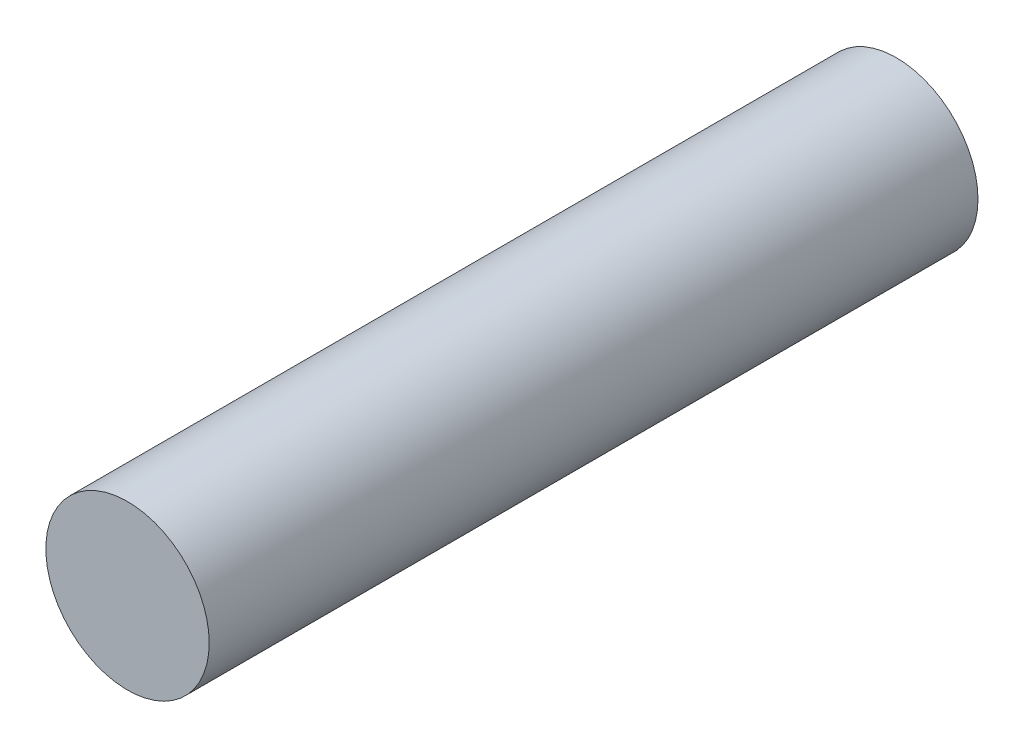
ISO-10303-21;
HEADER;
FILE_DESCRIPTION(('STEP AP214'),'2;1');
FILE_NAME('part.step','',(''),(''),'','','');
FILE_SCHEMA(('AUTOMOTIVE_DESIGN { 1 0 10303 214 1 1 1 1 }'));
ENDSEC;
DATA;
#1=APPLICATION_CONTEXT('core data for automotive mechanical design processes');
#2=APPLICATION_PROTOCOL_DEFINITION('international standard','automotive_design',2000,#1);
#3=PRODUCT_CONTEXT('',#1,'mechanical');
#4=PRODUCT('Part','Part','',(#3));
#5=PRODUCT_RELATED_PRODUCT_CATEGORY('part','',(#4));
#6=PRODUCT_DEFINITION_FORMATION('','',#4);
#7=PRODUCT_DEFINITION_CONTEXT('part definition',#1,'design');
#8=PRODUCT_DEFINITION('design','',#6,#7);
#9=PRODUCT_DEFINITION_SHAPE('','',#8);
#10=(LENGTH_UNIT() NAMED_UNIT(*) SI_UNIT(.MILLI.,.METRE.));
#11=(NAMED_UNIT(*) PLANE_ANGLE_UNIT() SI_UNIT($,.RADIAN.));
#12=(NAMED_UNIT(*) SI_UNIT($,.STERADIAN.) SOLID_ANGLE_UNIT());
#13=UNCERTAINTY_MEASURE_WITH_UNIT(LENGTH_MEASURE(1.E-05),#10,'distance_accuracy_value','');
#14=(GEOMETRIC_REPRESENTATION_CONTEXT(3) GLOBAL_UNCERTAINTY_ASSIGNED_CONTEXT((#13)) GLOBAL_UNIT_ASSIGNED_CONTEXT((#10,
#11,#12)) REPRESENTATION_CONTEXT('',''));
#15=CARTESIAN_POINT('',(0.,0.,0.));
#16=DIRECTION('',(0.,0.,1.));
#17=DIRECTION('',(1.,0.,0.));
#18=AXIS2_PLACEMENT_3D('',#15,#16,#17);
#19=CARTESIAN_POINT('',(0.,0.,16.));
#20=DIRECTION('',(0.,0.,-1.));
#21=DIRECTION('',(-1.,0.,0.));
#22=AXIS2_PLACEMENT_3D('',#19,#20,#21);
#23=CYLINDRICAL_SURFACE('',#22,1.7);
#24=CARTESIAN_POINT('',(0.,0.,16.));
#25=DIRECTION('',(0.,0.,1.));
#26=DIRECTION('',(1.,0.,0.));
#27=AXIS2_PLACEMENT_3D('',#24,#25,#26);
#28=CIRCLE('',#27,1.7);
#29=CARTESIAN_POINT('',(1.7,0.,16.));
#30=VERTEX_POINT('',#29);
#31=EDGE_CURVE('E10',#30,#30,#28,.T.);
#32=ORIENTED_EDGE('',*,*,#31,.F.);
#33=EDGE_LOOP('',(#32));
#34=FACE_BOUND('',#33,.T.);
#35=CARTESIAN_POINT('',(0.,0.,0.));
#36=DIRECTION('',(0.,0.,1.));
#37=DIRECTION('',(1.,0.,0.));
#38=AXIS2_PLACEMENT_3D('',#35,#36,#37);
#39=CIRCLE('',#38,1.7);
#40=CARTESIAN_POINT('',(1.7,0.,0.));
#41=VERTEX_POINT('',#40);
#42=EDGE_CURVE('E34',#41,#41,#39,.T.);
#43=ORIENTED_EDGE('',*,*,#42,.T.);
#44=EDGE_LOOP('',(#43));
#45=FACE_BOUND('',#44,.T.);
#46=ADVANCED_FACE('F28',(#34,#45),#23,.T.);
#47=CARTESIAN_POINT('',(0.,0.,16.));
#48=DIRECTION('',(0.,0.,1.));
#49=DIRECTION('',(1.,0.,0.));
#50=AXIS2_PLACEMENT_3D('',#47,#48,#49);
#51=PLANE('',#50);
#52=ORIENTED_EDGE('',*,*,#31,.T.);
#53=EDGE_LOOP('',(#52));
#54=FACE_BOUND('',#53,.T.);
#55=ADVANCED_FACE('F43',(#54),#51,.T.);
#56=CARTESIAN_POINT('',(0.,0.,0.));
#57=DIRECTION('',(0.,0.,1.));
#58=DIRECTION('',(1.,0.,0.));
#59=AXIS2_PLACEMENT_3D('',#56,#57,#58);
#60=PLANE('',#59);
#61=ORIENTED_EDGE('',*,*,#42,.F.);
#62=EDGE_LOOP('',(#61));
#63=FACE_BOUND('',#62,.T.);
#64=ADVANCED_FACE('F41',(#63),#60,.F.);
#65=CLOSED_SHELL('',(#46,#55,#64));
#66=MANIFOLD_SOLID_BREP('B2',#65);
#67=ADVANCED_BREP_SHAPE_REPRESENTATION('',(#18,#66),#14);
#68=SHAPE_DEFINITION_REPRESENTATION(#9,#67);
ENDSEC;
END-ISO-10303-21;
